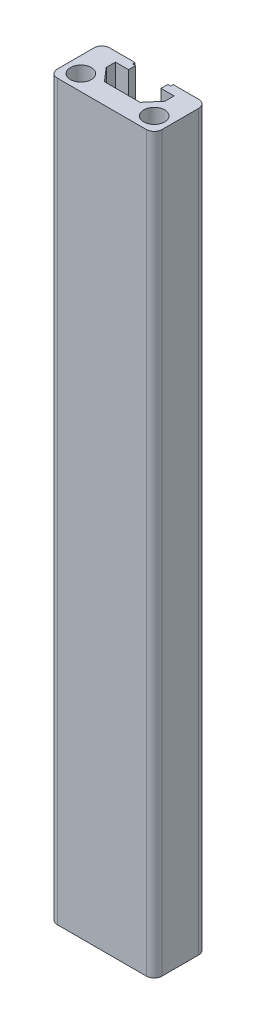
ISO-10303-21;
HEADER;
FILE_DESCRIPTION(('STEP AP214'),'2;1');
FILE_NAME('part.step','',(''),(''),'','','');
FILE_SCHEMA(('AUTOMOTIVE_DESIGN { 1 0 10303 214 1 1 1 1 }'));
ENDSEC;
DATA;
#1=APPLICATION_CONTEXT('core data for automotive mechanical design processes');
#2=APPLICATION_PROTOCOL_DEFINITION('international standard','automotive_design',2000,#1);
#3=PRODUCT_CONTEXT('',#1,'mechanical');
#4=PRODUCT('Part','Part','',(#3));
#5=PRODUCT_RELATED_PRODUCT_CATEGORY('part','',(#4));
#6=PRODUCT_DEFINITION_FORMATION('','',#4);
#7=PRODUCT_DEFINITION_CONTEXT('part definition',#1,'design');
#8=PRODUCT_DEFINITION('design','',#6,#7);
#9=PRODUCT_DEFINITION_SHAPE('','',#8);
#10=(LENGTH_UNIT() NAMED_UNIT(*) SI_UNIT(.MILLI.,.METRE.));
#11=(NAMED_UNIT(*) PLANE_ANGLE_UNIT() SI_UNIT($,.RADIAN.));
#12=(NAMED_UNIT(*) SI_UNIT($,.STERADIAN.) SOLID_ANGLE_UNIT());
#13=UNCERTAINTY_MEASURE_WITH_UNIT(LENGTH_MEASURE(1.E-05),#10,'distance_accuracy_value','');
#14=(GEOMETRIC_REPRESENTATION_CONTEXT(3) GLOBAL_UNCERTAINTY_ASSIGNED_CONTEXT((#13)) GLOBAL_UNIT_ASSIGNED_CONTEXT((#10,
#11,#12)) REPRESENTATION_CONTEXT('',''));
#15=CARTESIAN_POINT('',(0.,0.,0.));
#16=DIRECTION('',(0.,0.,1.));
#17=DIRECTION('',(1.,0.,0.));
#18=AXIS2_PLACEMENT_3D('',#15,#16,#17);
#19=CARTESIAN_POINT('',(0.,140.,0.));
#20=DIRECTION('',(0.,1.,0.));
#21=DIRECTION('',(0.,0.,1.));
#22=AXIS2_PLACEMENT_3D('',#19,#20,#21);
#23=PLANE('',#22);
#24=CARTESIAN_POINT('',(17.,140.,-3.));
#25=DIRECTION('',(0.,1.,0.));
#26=DIRECTION('',(0.,0.,1.));
#27=AXIS2_PLACEMENT_3D('',#24,#25,#26);
#28=CIRCLE('',#27,2.);
#29=CARTESIAN_POINT('',(17.,140.,-0.999999999999997));
#30=VERTEX_POINT('',#29);
#31=EDGE_CURVE('E262',#30,#30,#28,.T.);
#32=ORIENTED_EDGE('',*,*,#31,.F.);
#33=EDGE_LOOP('',(#32));
#34=FACE_BOUND('',#33,.T.);
#35=DIRECTION('',(-1.,0.,0.));
#36=VECTOR('',#35,1.);
#37=CARTESIAN_POINT('',(6.35,140.,-10.));
#38=LINE('',#37,#36);
#39=CARTESIAN_POINT('',(6.35,140.,-10.));
#40=VERTEX_POINT('',#39);
#41=CARTESIAN_POINT('',(1.5,140.,-10.));
#42=VERTEX_POINT('',#41);
#43=EDGE_CURVE('E253',#40,#42,#38,.T.);
#44=ORIENTED_EDGE('',*,*,#43,.T.);
#45=CARTESIAN_POINT('',(1.5,140.,-8.5));
#46=DIRECTION('',(0.,1.,0.));
#47=DIRECTION('',(0.,0.,1.));
#48=AXIS2_PLACEMENT_3D('',#45,#46,#47);
#49=CIRCLE('',#48,1.5);
#50=CARTESIAN_POINT('',(0.,140.,-8.5));
#51=VERTEX_POINT('',#50);
#52=EDGE_CURVE('E393',#42,#51,#49,.T.);
#53=ORIENTED_EDGE('',*,*,#52,.T.);
#54=DIRECTION('',(0.,0.,1.));
#55=VECTOR('',#54,1.);
#56=CARTESIAN_POINT('',(0.,140.,-10.));
#57=LINE('',#56,#55);
#58=CARTESIAN_POINT('',(0.,140.,-1.5));
#59=VERTEX_POINT('',#58);
#60=EDGE_CURVE('E314',#51,#59,#57,.T.);
#61=ORIENTED_EDGE('',*,*,#60,.T.);
#62=CARTESIAN_POINT('',(1.5,140.,-1.5));
#63=DIRECTION('',(0.,1.,0.));
#64=DIRECTION('',(0.,0.,1.));
#65=AXIS2_PLACEMENT_3D('',#62,#63,#64);
#66=CIRCLE('',#65,1.5);
#67=CARTESIAN_POINT('',(1.5,140.,0.));
#68=VERTEX_POINT('',#67);
#69=EDGE_CURVE('E390',#59,#68,#66,.T.);
#70=ORIENTED_EDGE('',*,*,#69,.T.);
#71=DIRECTION('',(1.,0.,0.));
#72=VECTOR('',#71,1.);
#73=CARTESIAN_POINT('',(0.,140.,0.));
#74=LINE('',#73,#72);
#75=CARTESIAN_POINT('',(18.5,140.,0.));
#76=VERTEX_POINT('',#75);
#77=EDGE_CURVE('E522',#68,#76,#74,.T.);
#78=ORIENTED_EDGE('',*,*,#77,.T.);
#79=CARTESIAN_POINT('',(18.5,140.,-1.5));
#80=DIRECTION('',(0.,1.,0.));
#81=DIRECTION('',(0.,0.,1.));
#82=AXIS2_PLACEMENT_3D('',#79,#80,#81);
#83=CIRCLE('',#82,1.5);
#84=CARTESIAN_POINT('',(20.,140.,-1.5));
#85=VERTEX_POINT('',#84);
#86=EDGE_CURVE('E385',#76,#85,#83,.T.);
#87=ORIENTED_EDGE('',*,*,#86,.T.);
#88=DIRECTION('',(0.,0.,-1.));
#89=VECTOR('',#88,1.);
#90=CARTESIAN_POINT('',(20.,140.,0.));
#91=LINE('',#90,#89);
#92=CARTESIAN_POINT('',(20.,140.,-8.5));
#93=VERTEX_POINT('',#92);
#94=EDGE_CURVE('E197',#85,#93,#91,.T.);
#95=ORIENTED_EDGE('',*,*,#94,.T.);
#96=CARTESIAN_POINT('',(18.5,140.,-8.5));
#97=DIRECTION('',(0.,1.,0.));
#98=DIRECTION('',(0.,0.,1.));
#99=AXIS2_PLACEMENT_3D('',#96,#97,#98);
#100=CIRCLE('',#99,1.5);
#101=CARTESIAN_POINT('',(18.5,140.,-10.));
#102=VERTEX_POINT('',#101);
#103=EDGE_CURVE('E55',#93,#102,#100,.T.);
#104=ORIENTED_EDGE('',*,*,#103,.T.);
#105=DIRECTION('',(-1.,0.,0.));
#106=VECTOR('',#105,1.);
#107=CARTESIAN_POINT('',(20.,140.,-10.));
#108=LINE('',#107,#106);
#109=CARTESIAN_POINT('',(13.65,140.,-10.));
#110=VERTEX_POINT('',#109);
#111=EDGE_CURVE('E186',#102,#110,#108,.T.);
#112=ORIENTED_EDGE('',*,*,#111,.T.);
#113=DIRECTION('',(0.,0.,1.));
#114=VECTOR('',#113,1.);
#115=CARTESIAN_POINT('',(13.65,140.,-9.51042760217637));
#116=LINE('',#115,#114);
#117=CARTESIAN_POINT('',(13.65,140.,-9.51042760217637));
#118=VERTEX_POINT('',#117);
#119=EDGE_CURVE('E191',#110,#118,#116,.T.);
#120=ORIENTED_EDGE('',*,*,#119,.T.);
#121=DIRECTION('',(-1.,0.,0.));
#122=VECTOR('',#121,1.);
#123=CARTESIAN_POINT('',(13.1,140.,-9.51042760217637));
#124=LINE('',#123,#122);
#125=CARTESIAN_POINT('',(13.1,140.,-9.51042760217637));
#126=VERTEX_POINT('',#125);
#127=EDGE_CURVE('E214',#118,#126,#124,.T.);
#128=ORIENTED_EDGE('',*,*,#127,.T.);
#129=DIRECTION('',(0.,0.,1.));
#130=VECTOR('',#129,1.);
#131=CARTESIAN_POINT('',(13.1,140.,-8.2));
#132=LINE('',#131,#130);
#133=CARTESIAN_POINT('',(13.1,140.,-8.2));
#134=VERTEX_POINT('',#133);
#135=EDGE_CURVE('E217',#126,#134,#132,.T.);
#136=ORIENTED_EDGE('',*,*,#135,.T.);
#137=DIRECTION('',(1.,0.,0.));
#138=VECTOR('',#137,1.);
#139=CARTESIAN_POINT('',(15.6,140.,-8.2));
#140=LINE('',#139,#138);
#141=CARTESIAN_POINT('',(15.6,140.,-8.2));
#142=VERTEX_POINT('',#141);
#143=EDGE_CURVE('E223',#134,#142,#140,.T.);
#144=ORIENTED_EDGE('',*,*,#143,.T.);
#145=DIRECTION('',(0.,0.,1.));
#146=VECTOR('',#145,1.);
#147=CARTESIAN_POINT('',(15.6,140.,-6.44750713590306));
#148=LINE('',#147,#146);
#149=CARTESIAN_POINT('',(15.6,140.,-6.44750713590306));
#150=VERTEX_POINT('',#149);
#151=EDGE_CURVE('E226',#142,#150,#148,.T.);
#152=ORIENTED_EDGE('',*,*,#151,.T.);
#153=DIRECTION('',(-0.651429062487269,0.,0.758709546893248));
#154=VECTOR('',#153,1.);
#155=CARTESIAN_POINT('',(13.4127068625717,140.,-3.9));
#156=LINE('',#155,#154);
#157=CARTESIAN_POINT('',(13.4127068625717,140.,-3.9));
#158=VERTEX_POINT('',#157);
#159=EDGE_CURVE('E229',#150,#158,#156,.T.);
#160=ORIENTED_EDGE('',*,*,#159,.T.);
#161=DIRECTION('',(-1.,0.,0.));
#162=VECTOR('',#161,1.);
#163=CARTESIAN_POINT('',(6.58729313742833,140.,-3.9));
#164=LINE('',#163,#162);
#165=CARTESIAN_POINT('',(6.58729313742833,140.,-3.9));
#166=VERTEX_POINT('',#165);
#167=EDGE_CURVE('E232',#158,#166,#164,.T.);
#168=ORIENTED_EDGE('',*,*,#167,.T.);
#169=DIRECTION('',(-0.651429062487269,0.,-0.758709546893248));
#170=VECTOR('',#169,1.);
#171=CARTESIAN_POINT('',(4.4,140.,-6.44750713590306));
#172=LINE('',#171,#170);
#173=CARTESIAN_POINT('',(4.4,140.,-6.44750713590306));
#174=VERTEX_POINT('',#173);
#175=EDGE_CURVE('E235',#166,#174,#172,.T.);
#176=ORIENTED_EDGE('',*,*,#175,.T.);
#177=DIRECTION('',(0.,0.,-1.));
#178=VECTOR('',#177,1.);
#179=CARTESIAN_POINT('',(4.4,140.,-8.2));
#180=LINE('',#179,#178);
#181=CARTESIAN_POINT('',(4.4,140.,-8.2));
#182=VERTEX_POINT('',#181);
#183=EDGE_CURVE('E238',#174,#182,#180,.T.);
#184=ORIENTED_EDGE('',*,*,#183,.T.);
#185=DIRECTION('',(1.,0.,0.));
#186=VECTOR('',#185,1.);
#187=CARTESIAN_POINT('',(6.9,140.,-8.2));
#188=LINE('',#187,#186);
#189=CARTESIAN_POINT('',(6.9,140.,-8.2));
#190=VERTEX_POINT('',#189);
#191=EDGE_CURVE('E241',#182,#190,#188,.T.);
#192=ORIENTED_EDGE('',*,*,#191,.T.);
#193=DIRECTION('',(0.,0.,-1.));
#194=VECTOR('',#193,1.);
#195=CARTESIAN_POINT('',(6.9,140.,-9.51042760217637));
#196=LINE('',#195,#194);
#197=CARTESIAN_POINT('',(6.9,140.,-9.51042760217637));
#198=VERTEX_POINT('',#197);
#199=EDGE_CURVE('E244',#190,#198,#196,.T.);
#200=ORIENTED_EDGE('',*,*,#199,.T.);
#201=DIRECTION('',(-1.,0.,0.));
#202=VECTOR('',#201,1.);
#203=CARTESIAN_POINT('',(6.35,140.,-9.51042760217637));
#204=LINE('',#203,#202);
#205=CARTESIAN_POINT('',(6.35,140.,-9.51042760217637));
#206=VERTEX_POINT('',#205);
#207=EDGE_CURVE('E247',#198,#206,#204,.T.);
#208=ORIENTED_EDGE('',*,*,#207,.T.);
#209=DIRECTION('',(0.,0.,-1.));
#210=VECTOR('',#209,1.);
#211=CARTESIAN_POINT('',(6.35,140.,-10.));
#212=LINE('',#211,#210);
#213=EDGE_CURVE('E250',#206,#40,#212,.T.);
#214=ORIENTED_EDGE('',*,*,#213,.T.);
#215=EDGE_LOOP('',(#44,#53,#61,#70,#78,#87,#95,#104,#112,#120,#128,#136,#144,#152,#160,#168,
#176,#184,#192,#200,#208,#214));
#216=FACE_BOUND('',#215,.T.);
#217=CARTESIAN_POINT('',(3.,140.,-3.));
#218=DIRECTION('',(0.,1.,0.));
#219=DIRECTION('',(0.,0.,1.));
#220=AXIS2_PLACEMENT_3D('',#217,#218,#219);
#221=CIRCLE('',#220,2.);
#222=CARTESIAN_POINT('',(3.,140.,-1.));
#223=VERTEX_POINT('',#222);
#224=EDGE_CURVE('E572',#223,#223,#221,.T.);
#225=ORIENTED_EDGE('',*,*,#224,.F.);
#226=EDGE_LOOP('',(#225));
#227=FACE_BOUND('',#226,.T.);
#228=ADVANCED_FACE('F39',(#34,#216,#227),#23,.T.);
#229=CARTESIAN_POINT('',(0.,0.,0.));
#230=DIRECTION('',(0.,1.,0.));
#231=DIRECTION('',(0.,0.,1.));
#232=AXIS2_PLACEMENT_3D('',#229,#230,#231);
#233=PLANE('',#232);
#234=DIRECTION('',(0.,0.,1.));
#235=VECTOR('',#234,1.);
#236=CARTESIAN_POINT('',(0.,0.,-10.));
#237=LINE('',#236,#235);
#238=CARTESIAN_POINT('',(0.,0.,-8.5));
#239=VERTEX_POINT('',#238);
#240=CARTESIAN_POINT('',(0.,0.,-1.5));
#241=VERTEX_POINT('',#240);
#242=EDGE_CURVE('E257',#239,#241,#237,.T.);
#243=ORIENTED_EDGE('',*,*,#242,.F.);
#244=CARTESIAN_POINT('',(1.5,0.,-8.5));
#245=DIRECTION('',(0.,1.,0.));
#246=DIRECTION('',(0.,0.,1.));
#247=AXIS2_PLACEMENT_3D('',#244,#245,#246);
#248=CIRCLE('',#247,1.5);
#249=CARTESIAN_POINT('',(1.5,0.,-10.));
#250=VERTEX_POINT('',#249);
#251=EDGE_CURVE('E379',#239,#250,#248,.F.);
#252=ORIENTED_EDGE('',*,*,#251,.T.);
#253=DIRECTION('',(-1.,0.,0.));
#254=VECTOR('',#253,1.);
#255=CARTESIAN_POINT('',(6.35,0.,-10.));
#256=LINE('',#255,#254);
#257=CARTESIAN_POINT('',(6.35,0.,-10.));
#258=VERTEX_POINT('',#257);
#259=EDGE_CURVE('E310',#258,#250,#256,.T.);
#260=ORIENTED_EDGE('',*,*,#259,.F.);
#261=DIRECTION('',(0.,0.,-1.));
#262=VECTOR('',#261,1.);
#263=CARTESIAN_POINT('',(6.35,0.,-10.));
#264=LINE('',#263,#262);
#265=CARTESIAN_POINT('',(6.35,0.,-9.51042760217637));
#266=VERTEX_POINT('',#265);
#267=EDGE_CURVE('E307',#266,#258,#264,.T.);
#268=ORIENTED_EDGE('',*,*,#267,.F.);
#269=DIRECTION('',(-1.,0.,0.));
#270=VECTOR('',#269,1.);
#271=CARTESIAN_POINT('',(6.35,0.,-9.51042760217637));
#272=LINE('',#271,#270);
#273=CARTESIAN_POINT('',(6.9,0.,-9.51042760217637));
#274=VERTEX_POINT('',#273);
#275=EDGE_CURVE('E304',#274,#266,#272,.T.);
#276=ORIENTED_EDGE('',*,*,#275,.F.);
#277=DIRECTION('',(0.,0.,-1.));
#278=VECTOR('',#277,1.);
#279=CARTESIAN_POINT('',(6.9,0.,-9.51042760217637));
#280=LINE('',#279,#278);
#281=CARTESIAN_POINT('',(6.9,0.,-8.2));
#282=VERTEX_POINT('',#281);
#283=EDGE_CURVE('E301',#282,#274,#280,.T.);
#284=ORIENTED_EDGE('',*,*,#283,.F.);
#285=DIRECTION('',(1.,0.,0.));
#286=VECTOR('',#285,1.);
#287=CARTESIAN_POINT('',(6.9,0.,-8.2));
#288=LINE('',#287,#286);
#289=CARTESIAN_POINT('',(4.4,0.,-8.2));
#290=VERTEX_POINT('',#289);
#291=EDGE_CURVE('E298',#290,#282,#288,.T.);
#292=ORIENTED_EDGE('',*,*,#291,.F.);
#293=DIRECTION('',(0.,0.,-1.));
#294=VECTOR('',#293,1.);
#295=CARTESIAN_POINT('',(4.4,0.,-8.2));
#296=LINE('',#295,#294);
#297=CARTESIAN_POINT('',(4.4,0.,-6.44750713590306));
#298=VERTEX_POINT('',#297);
#299=EDGE_CURVE('E295',#298,#290,#296,.T.);
#300=ORIENTED_EDGE('',*,*,#299,.F.);
#301=DIRECTION('',(-0.651429062487269,0.,-0.758709546893248));
#302=VECTOR('',#301,1.);
#303=CARTESIAN_POINT('',(4.4,0.,-6.44750713590306));
#304=LINE('',#303,#302);
#305=CARTESIAN_POINT('',(6.58729313742833,0.,-3.9));
#306=VERTEX_POINT('',#305);
#307=EDGE_CURVE('E292',#306,#298,#304,.T.);
#308=ORIENTED_EDGE('',*,*,#307,.F.);
#309=DIRECTION('',(-1.,0.,0.));
#310=VECTOR('',#309,1.);
#311=CARTESIAN_POINT('',(6.58729313742833,0.,-3.9));
#312=LINE('',#311,#310);
#313=CARTESIAN_POINT('',(13.4127068625717,0.,-3.9));
#314=VERTEX_POINT('',#313);
#315=EDGE_CURVE('E289',#314,#306,#312,.T.);
#316=ORIENTED_EDGE('',*,*,#315,.F.);
#317=DIRECTION('',(-0.651429062487269,0.,0.758709546893248));
#318=VECTOR('',#317,1.);
#319=CARTESIAN_POINT('',(13.4127068625717,0.,-3.9));
#320=LINE('',#319,#318);
#321=CARTESIAN_POINT('',(15.6,0.,-6.44750713590306));
#322=VERTEX_POINT('',#321);
#323=EDGE_CURVE('E286',#322,#314,#320,.T.);
#324=ORIENTED_EDGE('',*,*,#323,.F.);
#325=DIRECTION('',(0.,0.,1.));
#326=VECTOR('',#325,1.);
#327=CARTESIAN_POINT('',(15.6,0.,-6.44750713590306));
#328=LINE('',#327,#326);
#329=CARTESIAN_POINT('',(15.6,0.,-8.2));
#330=VERTEX_POINT('',#329);
#331=EDGE_CURVE('E283',#330,#322,#328,.T.);
#332=ORIENTED_EDGE('',*,*,#331,.F.);
#333=DIRECTION('',(1.,0.,0.));
#334=VECTOR('',#333,1.);
#335=CARTESIAN_POINT('',(15.6,0.,-8.2));
#336=LINE('',#335,#334);
#337=CARTESIAN_POINT('',(13.1,0.,-8.2));
#338=VERTEX_POINT('',#337);
#339=EDGE_CURVE('E280',#338,#330,#336,.T.);
#340=ORIENTED_EDGE('',*,*,#339,.F.);
#341=DIRECTION('',(0.,0.,1.));
#342=VECTOR('',#341,1.);
#343=CARTESIAN_POINT('',(13.1,0.,-8.2));
#344=LINE('',#343,#342);
#345=CARTESIAN_POINT('',(13.1,0.,-9.51042760217637));
#346=VERTEX_POINT('',#345);
#347=EDGE_CURVE('E277',#346,#338,#344,.T.);
#348=ORIENTED_EDGE('',*,*,#347,.F.);
#349=DIRECTION('',(-1.,0.,0.));
#350=VECTOR('',#349,1.);
#351=CARTESIAN_POINT('',(13.1,0.,-9.51042760217637));
#352=LINE('',#351,#350);
#353=CARTESIAN_POINT('',(13.65,0.,-9.51042760217637));
#354=VERTEX_POINT('',#353);
#355=EDGE_CURVE('E274',#354,#346,#352,.T.);
#356=ORIENTED_EDGE('',*,*,#355,.F.);
#357=DIRECTION('',(0.,0.,1.));
#358=VECTOR('',#357,1.);
#359=CARTESIAN_POINT('',(13.65,0.,-9.51042760217637));
#360=LINE('',#359,#358);
#361=CARTESIAN_POINT('',(13.65,0.,-10.));
#362=VERTEX_POINT('',#361);
#363=EDGE_CURVE('E271',#362,#354,#360,.T.);
#364=ORIENTED_EDGE('',*,*,#363,.F.);
#365=DIRECTION('',(-1.,0.,0.));
#366=VECTOR('',#365,1.);
#367=CARTESIAN_POINT('',(20.,0.,-10.));
#368=LINE('',#367,#366);
#369=CARTESIAN_POINT('',(18.5,0.,-10.));
#370=VERTEX_POINT('',#369);
#371=EDGE_CURVE('E203',#370,#362,#368,.T.);
#372=ORIENTED_EDGE('',*,*,#371,.F.);
#373=CARTESIAN_POINT('',(18.5,0.,-8.5));
#374=DIRECTION('',(0.,1.,0.));
#375=DIRECTION('',(0.,0.,1.));
#376=AXIS2_PLACEMENT_3D('',#373,#374,#375);
#377=CIRCLE('',#376,1.5);
#378=CARTESIAN_POINT('',(20.,0.,-8.5));
#379=VERTEX_POINT('',#378);
#380=EDGE_CURVE('E373',#370,#379,#377,.F.);
#381=ORIENTED_EDGE('',*,*,#380,.T.);
#382=DIRECTION('',(0.,0.,-1.));
#383=VECTOR('',#382,1.);
#384=CARTESIAN_POINT('',(20.,0.,0.));
#385=LINE('',#384,#383);
#386=CARTESIAN_POINT('',(20.,0.,-1.5));
#387=VERTEX_POINT('',#386);
#388=EDGE_CURVE('E266',#387,#379,#385,.T.);
#389=ORIENTED_EDGE('',*,*,#388,.F.);
#390=CARTESIAN_POINT('',(18.5,0.,-1.5));
#391=DIRECTION('',(0.,1.,0.));
#392=DIRECTION('',(0.,0.,1.));
#393=AXIS2_PLACEMENT_3D('',#390,#391,#392);
#394=CIRCLE('',#393,1.5);
#395=CARTESIAN_POINT('',(18.5,0.,0.));
#396=VERTEX_POINT('',#395);
#397=EDGE_CURVE('E370',#387,#396,#394,.F.);
#398=ORIENTED_EDGE('',*,*,#397,.T.);
#399=DIRECTION('',(1.,0.,0.));
#400=VECTOR('',#399,1.);
#401=CARTESIAN_POINT('',(0.,0.,0.));
#402=LINE('',#401,#400);
#403=CARTESIAN_POINT('',(1.5,0.,0.));
#404=VERTEX_POINT('',#403);
#405=EDGE_CURVE('E261',#404,#396,#402,.T.);
#406=ORIENTED_EDGE('',*,*,#405,.F.);
#407=CARTESIAN_POINT('',(1.5,0.,-1.5));
#408=DIRECTION('',(0.,1.,0.));
#409=DIRECTION('',(0.,0.,1.));
#410=AXIS2_PLACEMENT_3D('',#407,#408,#409);
#411=CIRCLE('',#410,1.5);
#412=EDGE_CURVE('E376',#404,#241,#411,.F.);
#413=ORIENTED_EDGE('',*,*,#412,.T.);
#414=EDGE_LOOP('',(#243,#252,#260,#268,#276,#284,#292,#300,#308,#316,#324,#332,#340,#348,#356,
#364,#372,#381,#389,#398,#406,#413));
#415=FACE_BOUND('',#414,.T.);
#416=CARTESIAN_POINT('',(17.,0.,-3.));
#417=DIRECTION('',(0.,1.,0.));
#418=DIRECTION('',(0.,0.,1.));
#419=AXIS2_PLACEMENT_3D('',#416,#417,#418);
#420=CIRCLE('',#419,2.);
#421=CARTESIAN_POINT('',(17.,0.,-0.999999999999997));
#422=VERTEX_POINT('',#421);
#423=EDGE_CURVE('E528',#422,#422,#420,.T.);
#424=ORIENTED_EDGE('',*,*,#423,.T.);
#425=EDGE_LOOP('',(#424));
#426=FACE_BOUND('',#425,.T.);
#427=CARTESIAN_POINT('',(3.,0.,-3.));
#428=DIRECTION('',(0.,1.,0.));
#429=DIRECTION('',(0.,0.,1.));
#430=AXIS2_PLACEMENT_3D('',#427,#428,#429);
#431=CIRCLE('',#430,2.);
#432=CARTESIAN_POINT('',(3.,0.,-1.));
#433=VERTEX_POINT('',#432);
#434=EDGE_CURVE('E576',#433,#433,#431,.T.);
#435=ORIENTED_EDGE('',*,*,#434,.T.);
#436=EDGE_LOOP('',(#435));
#437=FACE_BOUND('',#436,.T.);
#438=ADVANCED_FACE('F414',(#415,#426,#437),#233,.F.);
#439=CARTESIAN_POINT('',(0.,140.,-10.));
#440=DIRECTION('',(1.,0.,0.));
#441=DIRECTION('',(0.,0.,-1.));
#442=AXIS2_PLACEMENT_3D('',#439,#440,#441);
#443=PLANE('',#442);
#444=ORIENTED_EDGE('',*,*,#60,.F.);
#445=DIRECTION('',(0.,-1.,0.));
#446=VECTOR('',#445,1.);
#447=CARTESIAN_POINT('',(0.,140.,-8.5));
#448=LINE('',#447,#446);
#449=EDGE_CURVE('E366',#51,#239,#448,.T.);
#450=ORIENTED_EDGE('',*,*,#449,.T.);
#451=ORIENTED_EDGE('',*,*,#242,.T.);
#452=DIRECTION('',(0.,-1.,0.));
#453=VECTOR('',#452,1.);
#454=CARTESIAN_POINT('',(0.,140.,-1.5));
#455=LINE('',#454,#453);
#456=EDGE_CURVE('E207',#241,#59,#455,.F.);
#457=ORIENTED_EDGE('',*,*,#456,.T.);
#458=EDGE_LOOP('',(#444,#450,#451,#457));
#459=FACE_BOUND('',#458,.T.);
#460=ADVANCED_FACE('F434',(#459),#443,.F.);
#461=CARTESIAN_POINT('',(0.,140.,0.));
#462=DIRECTION('',(0.,0.,-1.));
#463=DIRECTION('',(-1.,0.,0.));
#464=AXIS2_PLACEMENT_3D('',#461,#462,#463);
#465=PLANE('',#464);
#466=ORIENTED_EDGE('',*,*,#77,.F.);
#467=DIRECTION('',(0.,-1.,0.));
#468=VECTOR('',#467,1.);
#469=CARTESIAN_POINT('',(1.5,140.,0.));
#470=LINE('',#469,#468);
#471=EDGE_CURVE('E399',#68,#404,#470,.T.);
#472=ORIENTED_EDGE('',*,*,#471,.T.);
#473=ORIENTED_EDGE('',*,*,#405,.T.);
#474=DIRECTION('',(0.,-1.,0.));
#475=VECTOR('',#474,1.);
#476=CARTESIAN_POINT('',(18.5,140.,0.));
#477=LINE('',#476,#475);
#478=EDGE_CURVE('E396',#396,#76,#477,.F.);
#479=ORIENTED_EDGE('',*,*,#478,.T.);
#480=EDGE_LOOP('',(#466,#472,#473,#479));
#481=FACE_BOUND('',#480,.T.);
#482=ADVANCED_FACE('F499',(#481),#465,.F.);
#483=CARTESIAN_POINT('',(20.,140.,0.));
#484=DIRECTION('',(-1.,0.,0.));
#485=DIRECTION('',(0.,0.,1.));
#486=AXIS2_PLACEMENT_3D('',#483,#484,#485);
#487=PLANE('',#486);
#488=ORIENTED_EDGE('',*,*,#388,.T.);
#489=DIRECTION('',(0.,-1.,0.));
#490=VECTOR('',#489,1.);
#491=CARTESIAN_POINT('',(20.,140.,-8.5));
#492=LINE('',#491,#490);
#493=EDGE_CURVE('E11',#379,#93,#492,.F.);
#494=ORIENTED_EDGE('',*,*,#493,.T.);
#495=ORIENTED_EDGE('',*,*,#94,.F.);
#496=DIRECTION('',(0.,-1.,0.));
#497=VECTOR('',#496,1.);
#498=CARTESIAN_POINT('',(20.,140.,-1.5));
#499=LINE('',#498,#497);
#500=EDGE_CURVE('E48',#85,#387,#499,.T.);
#501=ORIENTED_EDGE('',*,*,#500,.T.);
#502=EDGE_LOOP('',(#488,#494,#495,#501));
#503=FACE_BOUND('',#502,.T.);
#504=ADVANCED_FACE('F409',(#503),#487,.F.);
#505=CARTESIAN_POINT('',(20.,140.,-10.));
#506=DIRECTION('',(0.,0.,1.));
#507=DIRECTION('',(1.,0.,0.));
#508=AXIS2_PLACEMENT_3D('',#505,#506,#507);
#509=PLANE('',#508);
#510=ORIENTED_EDGE('',*,*,#111,.F.);
#511=DIRECTION('',(0.,-1.,0.));
#512=VECTOR('',#511,1.);
#513=CARTESIAN_POINT('',(18.5,140.,-10.));
#514=LINE('',#513,#512);
#515=EDGE_CURVE('E403',#102,#370,#514,.T.);
#516=ORIENTED_EDGE('',*,*,#515,.T.);
#517=ORIENTED_EDGE('',*,*,#371,.T.);
#518=DIRECTION('',(0.,-1.,0.));
#519=VECTOR('',#518,1.);
#520=CARTESIAN_POINT('',(13.65,140.,-10.));
#521=LINE('',#520,#519);
#522=EDGE_CURVE('E200',#110,#362,#521,.T.);
#523=ORIENTED_EDGE('',*,*,#522,.F.);
#524=EDGE_LOOP('',(#510,#516,#517,#523));
#525=FACE_BOUND('',#524,.T.);
#526=ADVANCED_FACE('F201',(#525),#509,.F.);
#527=CARTESIAN_POINT('',(13.65,140.,-9.51042760217637));
#528=DIRECTION('',(1.,0.,0.));
#529=DIRECTION('',(0.,0.,-1.));
#530=AXIS2_PLACEMENT_3D('',#527,#528,#529);
#531=PLANE('',#530);
#532=ORIENTED_EDGE('',*,*,#363,.T.);
#533=DIRECTION('',(0.,-1.,0.));
#534=VECTOR('',#533,1.);
#535=CARTESIAN_POINT('',(13.65,140.,-9.51042760217637));
#536=LINE('',#535,#534);
#537=EDGE_CURVE('E208',#118,#354,#536,.T.);
#538=ORIENTED_EDGE('',*,*,#537,.F.);
#539=ORIENTED_EDGE('',*,*,#119,.F.);
#540=ORIENTED_EDGE('',*,*,#522,.T.);
#541=EDGE_LOOP('',(#532,#538,#539,#540));
#542=FACE_BOUND('',#541,.T.);
#543=ADVANCED_FACE('F210',(#542),#531,.F.);
#544=CARTESIAN_POINT('',(13.1,140.,-9.51042760217637));
#545=DIRECTION('',(0.,0.,1.));
#546=DIRECTION('',(1.,0.,0.));
#547=AXIS2_PLACEMENT_3D('',#544,#545,#546);
#548=PLANE('',#547);
#549=ORIENTED_EDGE('',*,*,#355,.T.);
#550=DIRECTION('',(0.,-1.,0.));
#551=VECTOR('',#550,1.);
#552=CARTESIAN_POINT('',(13.1,140.,-9.51042760217637));
#553=LINE('',#552,#551);
#554=EDGE_CURVE('E358',#126,#346,#553,.T.);
#555=ORIENTED_EDGE('',*,*,#554,.F.);
#556=ORIENTED_EDGE('',*,*,#127,.F.);
#557=ORIENTED_EDGE('',*,*,#537,.T.);
#558=EDGE_LOOP('',(#549,#555,#556,#557));
#559=FACE_BOUND('',#558,.T.);
#560=ADVANCED_FACE('F488',(#559),#548,.F.);
#561=CARTESIAN_POINT('',(13.1,140.,-8.2));
#562=DIRECTION('',(1.,0.,0.));
#563=DIRECTION('',(0.,0.,-1.));
#564=AXIS2_PLACEMENT_3D('',#561,#562,#563);
#565=PLANE('',#564);
#566=ORIENTED_EDGE('',*,*,#347,.T.);
#567=DIRECTION('',(0.,-1.,0.));
#568=VECTOR('',#567,1.);
#569=CARTESIAN_POINT('',(13.1,140.,-8.2));
#570=LINE('',#569,#568);
#571=EDGE_CURVE('E354',#134,#338,#570,.T.);
#572=ORIENTED_EDGE('',*,*,#571,.F.);
#573=ORIENTED_EDGE('',*,*,#135,.F.);
#574=ORIENTED_EDGE('',*,*,#554,.T.);
#575=EDGE_LOOP('',(#566,#572,#573,#574));
#576=FACE_BOUND('',#575,.T.);
#577=ADVANCED_FACE('F484',(#576),#565,.F.);
#578=CARTESIAN_POINT('',(15.6,140.,-8.2));
#579=DIRECTION('',(0.,0.,-1.));
#580=DIRECTION('',(-1.,0.,0.));
#581=AXIS2_PLACEMENT_3D('',#578,#579,#580);
#582=PLANE('',#581);
#583=ORIENTED_EDGE('',*,*,#339,.T.);
#584=DIRECTION('',(0.,-1.,0.));
#585=VECTOR('',#584,1.);
#586=CARTESIAN_POINT('',(15.6,140.,-8.2));
#587=LINE('',#586,#585);
#588=EDGE_CURVE('E350',#142,#330,#587,.T.);
#589=ORIENTED_EDGE('',*,*,#588,.F.);
#590=ORIENTED_EDGE('',*,*,#143,.F.);
#591=ORIENTED_EDGE('',*,*,#571,.T.);
#592=EDGE_LOOP('',(#583,#589,#590,#591));
#593=FACE_BOUND('',#592,.T.);
#594=ADVANCED_FACE('F480',(#593),#582,.F.);
#595=CARTESIAN_POINT('',(15.6,140.,-6.44750713590306));
#596=DIRECTION('',(1.,0.,0.));
#597=DIRECTION('',(0.,0.,-1.));
#598=AXIS2_PLACEMENT_3D('',#595,#596,#597);
#599=PLANE('',#598);
#600=ORIENTED_EDGE('',*,*,#331,.T.);
#601=DIRECTION('',(0.,-1.,0.));
#602=VECTOR('',#601,1.);
#603=CARTESIAN_POINT('',(15.6,140.,-6.44750713590306));
#604=LINE('',#603,#602);
#605=EDGE_CURVE('E346',#150,#322,#604,.T.);
#606=ORIENTED_EDGE('',*,*,#605,.F.);
#607=ORIENTED_EDGE('',*,*,#151,.F.);
#608=ORIENTED_EDGE('',*,*,#588,.T.);
#609=EDGE_LOOP('',(#600,#606,#607,#608));
#610=FACE_BOUND('',#609,.T.);
#611=ADVANCED_FACE('F476',(#610),#599,.F.);
#612=CARTESIAN_POINT('',(13.4127068625717,140.,-3.9));
#613=DIRECTION('',(0.758709546893248,0.,0.651429062487269));
#614=DIRECTION('',(0.651429062487269,0.,-0.758709546893248));
#615=AXIS2_PLACEMENT_3D('',#612,#613,#614);
#616=PLANE('',#615);
#617=ORIENTED_EDGE('',*,*,#323,.T.);
#618=DIRECTION('',(0.,-1.,0.));
#619=VECTOR('',#618,1.);
#620=CARTESIAN_POINT('',(13.4127068625717,140.,-3.9));
#621=LINE('',#620,#619);
#622=EDGE_CURVE('E342',#158,#314,#621,.T.);
#623=ORIENTED_EDGE('',*,*,#622,.F.);
#624=ORIENTED_EDGE('',*,*,#159,.F.);
#625=ORIENTED_EDGE('',*,*,#605,.T.);
#626=EDGE_LOOP('',(#617,#623,#624,#625));
#627=FACE_BOUND('',#626,.T.);
#628=ADVANCED_FACE('F472',(#627),#616,.F.);
#629=CARTESIAN_POINT('',(6.58729313742833,140.,-3.9));
#630=DIRECTION('',(0.,0.,1.));
#631=DIRECTION('',(1.,0.,0.));
#632=AXIS2_PLACEMENT_3D('',#629,#630,#631);
#633=PLANE('',#632);
#634=ORIENTED_EDGE('',*,*,#315,.T.);
#635=DIRECTION('',(0.,-1.,0.));
#636=VECTOR('',#635,1.);
#637=CARTESIAN_POINT('',(6.58729313742833,140.,-3.9));
#638=LINE('',#637,#636);
#639=EDGE_CURVE('E338',#166,#306,#638,.T.);
#640=ORIENTED_EDGE('',*,*,#639,.F.);
#641=ORIENTED_EDGE('',*,*,#167,.F.);
#642=ORIENTED_EDGE('',*,*,#622,.T.);
#643=EDGE_LOOP('',(#634,#640,#641,#642));
#644=FACE_BOUND('',#643,.T.);
#645=ADVANCED_FACE('F468',(#644),#633,.F.);
#646=CARTESIAN_POINT('',(4.4,140.,-6.44750713590306));
#647=DIRECTION('',(-0.758709546893248,0.,0.651429062487269));
#648=DIRECTION('',(0.651429062487269,0.,0.758709546893248));
#649=AXIS2_PLACEMENT_3D('',#646,#647,#648);
#650=PLANE('',#649);
#651=ORIENTED_EDGE('',*,*,#307,.T.);
#652=DIRECTION('',(0.,-1.,0.));
#653=VECTOR('',#652,1.);
#654=CARTESIAN_POINT('',(4.4,140.,-6.44750713590306));
#655=LINE('',#654,#653);
#656=EDGE_CURVE('E334',#174,#298,#655,.T.);
#657=ORIENTED_EDGE('',*,*,#656,.F.);
#658=ORIENTED_EDGE('',*,*,#175,.F.);
#659=ORIENTED_EDGE('',*,*,#639,.T.);
#660=EDGE_LOOP('',(#651,#657,#658,#659));
#661=FACE_BOUND('',#660,.T.);
#662=ADVANCED_FACE('F464',(#661),#650,.F.);
#663=CARTESIAN_POINT('',(4.4,140.,-8.2));
#664=DIRECTION('',(-1.,0.,0.));
#665=DIRECTION('',(0.,0.,1.));
#666=AXIS2_PLACEMENT_3D('',#663,#664,#665);
#667=PLANE('',#666);
#668=ORIENTED_EDGE('',*,*,#299,.T.);
#669=DIRECTION('',(0.,-1.,0.));
#670=VECTOR('',#669,1.);
#671=CARTESIAN_POINT('',(4.4,140.,-8.2));
#672=LINE('',#671,#670);
#673=EDGE_CURVE('E330',#182,#290,#672,.T.);
#674=ORIENTED_EDGE('',*,*,#673,.F.);
#675=ORIENTED_EDGE('',*,*,#183,.F.);
#676=ORIENTED_EDGE('',*,*,#656,.T.);
#677=EDGE_LOOP('',(#668,#674,#675,#676));
#678=FACE_BOUND('',#677,.T.);
#679=ADVANCED_FACE('F460',(#678),#667,.F.);
#680=CARTESIAN_POINT('',(6.9,140.,-8.2));
#681=DIRECTION('',(0.,0.,-1.));
#682=DIRECTION('',(-1.,0.,0.));
#683=AXIS2_PLACEMENT_3D('',#680,#681,#682);
#684=PLANE('',#683);
#685=ORIENTED_EDGE('',*,*,#291,.T.);
#686=DIRECTION('',(0.,-1.,0.));
#687=VECTOR('',#686,1.);
#688=CARTESIAN_POINT('',(6.9,140.,-8.2));
#689=LINE('',#688,#687);
#690=EDGE_CURVE('E326',#190,#282,#689,.T.);
#691=ORIENTED_EDGE('',*,*,#690,.F.);
#692=ORIENTED_EDGE('',*,*,#191,.F.);
#693=ORIENTED_EDGE('',*,*,#673,.T.);
#694=EDGE_LOOP('',(#685,#691,#692,#693));
#695=FACE_BOUND('',#694,.T.);
#696=ADVANCED_FACE('F456',(#695),#684,.F.);
#697=CARTESIAN_POINT('',(6.9,140.,-9.51042760217637));
#698=DIRECTION('',(-1.,0.,0.));
#699=DIRECTION('',(0.,0.,1.));
#700=AXIS2_PLACEMENT_3D('',#697,#698,#699);
#701=PLANE('',#700);
#702=ORIENTED_EDGE('',*,*,#283,.T.);
#703=DIRECTION('',(0.,-1.,0.));
#704=VECTOR('',#703,1.);
#705=CARTESIAN_POINT('',(6.9,140.,-9.51042760217637));
#706=LINE('',#705,#704);
#707=EDGE_CURVE('E322',#198,#274,#706,.T.);
#708=ORIENTED_EDGE('',*,*,#707,.F.);
#709=ORIENTED_EDGE('',*,*,#199,.F.);
#710=ORIENTED_EDGE('',*,*,#690,.T.);
#711=EDGE_LOOP('',(#702,#708,#709,#710));
#712=FACE_BOUND('',#711,.T.);
#713=ADVANCED_FACE('F452',(#712),#701,.F.);
#714=CARTESIAN_POINT('',(6.35,140.,-9.51042760217637));
#715=DIRECTION('',(0.,0.,1.));
#716=DIRECTION('',(1.,0.,0.));
#717=AXIS2_PLACEMENT_3D('',#714,#715,#716);
#718=PLANE('',#717);
#719=ORIENTED_EDGE('',*,*,#275,.T.);
#720=DIRECTION('',(0.,-1.,0.));
#721=VECTOR('',#720,1.);
#722=CARTESIAN_POINT('',(6.35,140.,-9.51042760217637));
#723=LINE('',#722,#721);
#724=EDGE_CURVE('E318',#206,#266,#723,.T.);
#725=ORIENTED_EDGE('',*,*,#724,.F.);
#726=ORIENTED_EDGE('',*,*,#207,.F.);
#727=ORIENTED_EDGE('',*,*,#707,.T.);
#728=EDGE_LOOP('',(#719,#725,#726,#727));
#729=FACE_BOUND('',#728,.T.);
#730=ADVANCED_FACE('F448',(#729),#718,.F.);
#731=CARTESIAN_POINT('',(6.35,140.,-10.));
#732=DIRECTION('',(-1.,0.,0.));
#733=DIRECTION('',(0.,0.,1.));
#734=AXIS2_PLACEMENT_3D('',#731,#732,#733);
#735=PLANE('',#734);
#736=ORIENTED_EDGE('',*,*,#267,.T.);
#737=DIRECTION('',(0.,-1.,0.));
#738=VECTOR('',#737,1.);
#739=CARTESIAN_POINT('',(6.35,140.,-10.));
#740=LINE('',#739,#738);
#741=EDGE_CURVE('E256',#40,#258,#740,.T.);
#742=ORIENTED_EDGE('',*,*,#741,.F.);
#743=ORIENTED_EDGE('',*,*,#213,.F.);
#744=ORIENTED_EDGE('',*,*,#724,.T.);
#745=EDGE_LOOP('',(#736,#742,#743,#744));
#746=FACE_BOUND('',#745,.T.);
#747=ADVANCED_FACE('F444',(#746),#735,.F.);
#748=CARTESIAN_POINT('',(6.35,140.,-10.));
#749=DIRECTION('',(0.,0.,1.));
#750=DIRECTION('',(1.,0.,0.));
#751=AXIS2_PLACEMENT_3D('',#748,#749,#750);
#752=PLANE('',#751);
#753=ORIENTED_EDGE('',*,*,#259,.T.);
#754=DIRECTION('',(0.,-1.,0.));
#755=VECTOR('',#754,1.);
#756=CARTESIAN_POINT('',(1.5,140.,-10.));
#757=LINE('',#756,#755);
#758=EDGE_CURVE('E382',#250,#42,#757,.F.);
#759=ORIENTED_EDGE('',*,*,#758,.T.);
#760=ORIENTED_EDGE('',*,*,#43,.F.);
#761=ORIENTED_EDGE('',*,*,#741,.T.);
#762=EDGE_LOOP('',(#753,#759,#760,#761));
#763=FACE_BOUND('',#762,.T.);
#764=ADVANCED_FACE('F441',(#763),#752,.F.);
#765=CARTESIAN_POINT('',(17.,140.,-3.));
#766=DIRECTION('',(0.,-1.,0.));
#767=DIRECTION('',(0.,0.,-1.));
#768=AXIS2_PLACEMENT_3D('',#765,#766,#767);
#769=CYLINDRICAL_SURFACE('',#768,2.);
#770=ORIENTED_EDGE('',*,*,#31,.T.);
#771=EDGE_LOOP('',(#770));
#772=FACE_BOUND('',#771,.T.);
#773=ORIENTED_EDGE('',*,*,#423,.F.);
#774=EDGE_LOOP('',(#773));
#775=FACE_BOUND('',#774,.T.);
#776=ADVANCED_FACE('F438',(#772,#775),#769,.F.);
#777=CARTESIAN_POINT('',(3.,140.,-3.));
#778=DIRECTION('',(0.,-1.,0.));
#779=DIRECTION('',(0.,0.,-1.));
#780=AXIS2_PLACEMENT_3D('',#777,#778,#779);
#781=CYLINDRICAL_SURFACE('',#780,2.);
#782=ORIENTED_EDGE('',*,*,#224,.T.);
#783=EDGE_LOOP('',(#782));
#784=FACE_BOUND('',#783,.T.);
#785=ORIENTED_EDGE('',*,*,#434,.F.);
#786=EDGE_LOOP('',(#785));
#787=FACE_BOUND('',#786,.T.);
#788=ADVANCED_FACE('F507',(#784,#787),#781,.F.);
#789=CARTESIAN_POINT('',(1.5,140.,-8.5));
#790=DIRECTION('',(0.,-1.,0.));
#791=DIRECTION('',(0.,0.,-1.));
#792=AXIS2_PLACEMENT_3D('',#789,#790,#791);
#793=CYLINDRICAL_SURFACE('',#792,1.5);
#794=ORIENTED_EDGE('',*,*,#52,.F.);
#795=ORIENTED_EDGE('',*,*,#758,.F.);
#796=ORIENTED_EDGE('',*,*,#251,.F.);
#797=ORIENTED_EDGE('',*,*,#449,.F.);
#798=EDGE_LOOP('',(#794,#795,#796,#797));
#799=FACE_BOUND('',#798,.T.);
#800=ADVANCED_FACE('F425',(#799),#793,.T.);
#801=CARTESIAN_POINT('',(1.5,140.,-1.5));
#802=DIRECTION('',(0.,-1.,0.));
#803=DIRECTION('',(0.,0.,-1.));
#804=AXIS2_PLACEMENT_3D('',#801,#802,#803);
#805=CYLINDRICAL_SURFACE('',#804,1.5);
#806=ORIENTED_EDGE('',*,*,#69,.F.);
#807=ORIENTED_EDGE('',*,*,#456,.F.);
#808=ORIENTED_EDGE('',*,*,#412,.F.);
#809=ORIENTED_EDGE('',*,*,#471,.F.);
#810=EDGE_LOOP('',(#806,#807,#808,#809));
#811=FACE_BOUND('',#810,.T.);
#812=ADVANCED_FACE('F420',(#811),#805,.T.);
#813=CARTESIAN_POINT('',(18.5,140.,-8.5));
#814=DIRECTION('',(0.,-1.,0.));
#815=DIRECTION('',(0.,0.,-1.));
#816=AXIS2_PLACEMENT_3D('',#813,#814,#815);
#817=CYLINDRICAL_SURFACE('',#816,1.5);
#818=ORIENTED_EDGE('',*,*,#103,.F.);
#819=ORIENTED_EDGE('',*,*,#493,.F.);
#820=ORIENTED_EDGE('',*,*,#380,.F.);
#821=ORIENTED_EDGE('',*,*,#515,.F.);
#822=EDGE_LOOP('',(#818,#819,#820,#821));
#823=FACE_BOUND('',#822,.T.);
#824=ADVANCED_FACE('F418',(#823),#817,.T.);
#825=CARTESIAN_POINT('',(18.5,140.,-1.5));
#826=DIRECTION('',(0.,-1.,0.));
#827=DIRECTION('',(0.,0.,-1.));
#828=AXIS2_PLACEMENT_3D('',#825,#826,#827);
#829=CYLINDRICAL_SURFACE('',#828,1.5);
#830=ORIENTED_EDGE('',*,*,#86,.F.);
#831=ORIENTED_EDGE('',*,*,#478,.F.);
#832=ORIENTED_EDGE('',*,*,#397,.F.);
#833=ORIENTED_EDGE('',*,*,#500,.F.);
#834=EDGE_LOOP('',(#830,#831,#832,#833));
#835=FACE_BOUND('',#834,.T.);
#836=ADVANCED_FACE('F41',(#835),#829,.T.);
#837=CLOSED_SHELL('',(#228,#438,#460,#482,#504,#526,#543,#560,#577,#594,#611,#628,#645,#662,
#679,#696,#713,#730,#747,#764,#776,#788,#800,#812,#824,#836));
#838=MANIFOLD_SOLID_BREP('B2',#837);
#839=ADVANCED_BREP_SHAPE_REPRESENTATION('',(#18,#838),#14);
#840=SHAPE_DEFINITION_REPRESENTATION(#9,#839);
ENDSEC;
END-ISO-10303-21;
